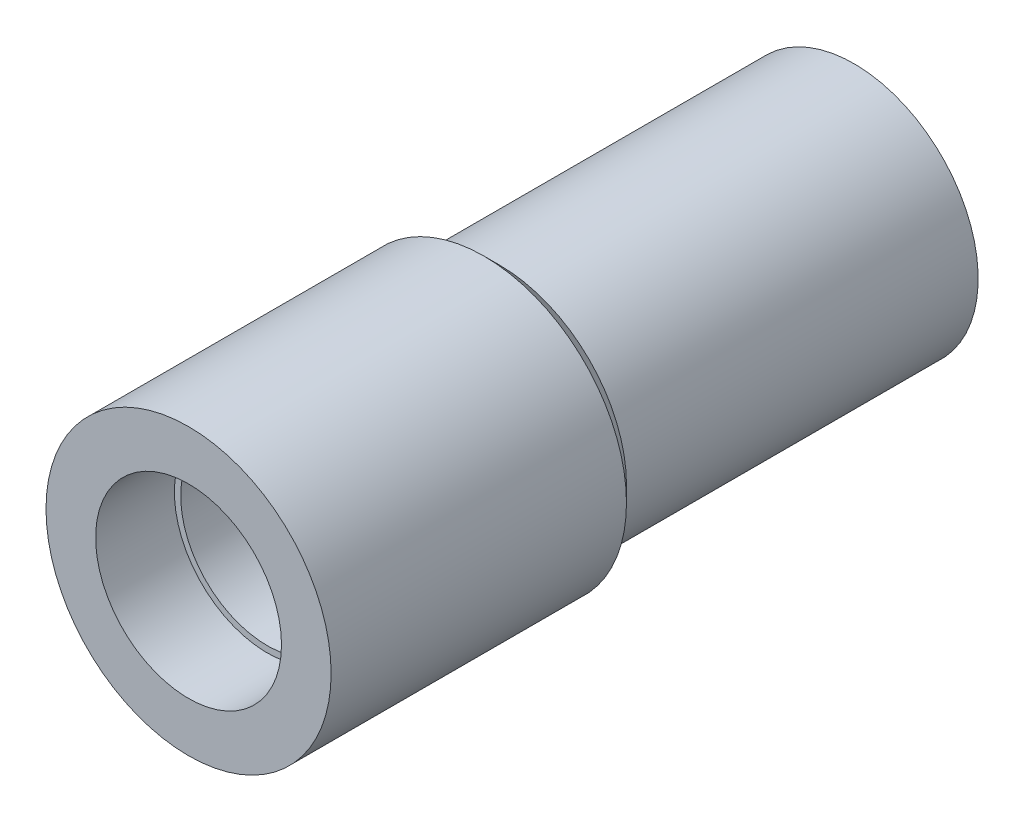
ISO-10303-21;
HEADER;
FILE_DESCRIPTION(('STEP AP214'),'2;1');
FILE_NAME('part.step','',(''),(''),'','','');
FILE_SCHEMA(('AUTOMOTIVE_DESIGN { 1 0 10303 214 1 1 1 1 }'));
ENDSEC;
DATA;
#1=APPLICATION_CONTEXT('core data for automotive mechanical design processes');
#2=APPLICATION_PROTOCOL_DEFINITION('international standard','automotive_design',2000,#1);
#3=PRODUCT_CONTEXT('',#1,'mechanical');
#4=PRODUCT('Part','Part','',(#3));
#5=PRODUCT_RELATED_PRODUCT_CATEGORY('part','',(#4));
#6=PRODUCT_DEFINITION_FORMATION('','',#4);
#7=PRODUCT_DEFINITION_CONTEXT('part definition',#1,'design');
#8=PRODUCT_DEFINITION('design','',#6,#7);
#9=PRODUCT_DEFINITION_SHAPE('','',#8);
#10=(LENGTH_UNIT() NAMED_UNIT(*) SI_UNIT(.MILLI.,.METRE.));
#11=(NAMED_UNIT(*) PLANE_ANGLE_UNIT() SI_UNIT($,.RADIAN.));
#12=(NAMED_UNIT(*) SI_UNIT($,.STERADIAN.) SOLID_ANGLE_UNIT());
#13=UNCERTAINTY_MEASURE_WITH_UNIT(LENGTH_MEASURE(1.E-05),#10,'distance_accuracy_value','');
#14=(GEOMETRIC_REPRESENTATION_CONTEXT(3) GLOBAL_UNCERTAINTY_ASSIGNED_CONTEXT((#13)) GLOBAL_UNIT_ASSIGNED_CONTEXT((#10,
#11,#12)) REPRESENTATION_CONTEXT('',''));
#15=CARTESIAN_POINT('',(0.,0.,0.));
#16=DIRECTION('',(0.,0.,1.));
#17=DIRECTION('',(1.,0.,0.));
#18=AXIS2_PLACEMENT_3D('',#15,#16,#17);
#19=CARTESIAN_POINT('',(0.,0.,0.));
#20=DIRECTION('',(0.,0.,1.));
#21=DIRECTION('',(1.,0.,0.));
#22=AXIS2_PLACEMENT_3D('',#19,#20,#21);
#23=CYLINDRICAL_SURFACE('',#22,2.794);
#24=CARTESIAN_POINT('',(0.,0.,18.923));
#25=DIRECTION('',(0.,0.,1.));
#26=DIRECTION('',(1.,0.,0.));
#27=AXIS2_PLACEMENT_3D('',#24,#25,#26);
#28=CIRCLE('',#27,2.794);
#29=CARTESIAN_POINT('',(2.794,0.,18.923));
#30=VERTEX_POINT('',#29);
#31=EDGE_CURVE('E52',#30,#30,#28,.F.);
#32=ORIENTED_EDGE('',*,*,#31,.F.);
#33=EDGE_LOOP('',(#32));
#34=FACE_BOUND('',#33,.T.);
#35=CARTESIAN_POINT('',(0.,0.,2.54));
#36=DIRECTION('',(0.,0.,-1.));
#37=DIRECTION('',(-1.,0.,0.));
#38=AXIS2_PLACEMENT_3D('',#35,#36,#37);
#39=CIRCLE('',#38,2.794);
#40=CARTESIAN_POINT('',(-2.794,0.,2.54));
#41=VERTEX_POINT('',#40);
#42=EDGE_CURVE('E55',#41,#41,#39,.F.);
#43=ORIENTED_EDGE('',*,*,#42,.F.);
#44=EDGE_LOOP('',(#43));
#45=FACE_BOUND('',#44,.T.);
#46=ADVANCED_FACE('F37',(#34,#45),#23,.F.);
#47=CARTESIAN_POINT('',(0.,0.,21.463));
#48=DIRECTION('',(0.,0.,-1.));
#49=DIRECTION('',(-1.,0.,0.));
#50=AXIS2_PLACEMENT_3D('',#47,#48,#49);
#51=CYLINDRICAL_SURFACE('',#50,4.5974);
#52=CARTESIAN_POINT('',(0.,0.,11.938));
#53=DIRECTION('',(0.,0.,-1.));
#54=DIRECTION('',(-1.,0.,0.));
#55=AXIS2_PLACEMENT_3D('',#52,#53,#54);
#56=CIRCLE('',#55,4.5974);
#57=CARTESIAN_POINT('',(-4.5974,0.,11.938));
#58=VERTEX_POINT('',#57);
#59=EDGE_CURVE('E11',#58,#58,#56,.F.);
#60=ORIENTED_EDGE('',*,*,#59,.T.);
#61=EDGE_LOOP('',(#60));
#62=FACE_BOUND('',#61,.T.);
#63=CARTESIAN_POINT('',(0.,0.,21.463));
#64=DIRECTION('',(0.,0.,1.));
#65=DIRECTION('',(1.,0.,0.));
#66=AXIS2_PLACEMENT_3D('',#63,#64,#65);
#67=CIRCLE('',#66,4.5974);
#68=CARTESIAN_POINT('',(4.5974,0.,21.463));
#69=VERTEX_POINT('',#68);
#70=EDGE_CURVE('E48',#69,#69,#67,.T.);
#71=ORIENTED_EDGE('',*,*,#70,.F.);
#72=EDGE_LOOP('',(#71));
#73=FACE_BOUND('',#72,.T.);
#74=ADVANCED_FACE('F39',(#62,#73),#51,.T.);
#75=CARTESIAN_POINT('',(0.,0.,0.));
#76=DIRECTION('',(0.,0.,1.));
#77=DIRECTION('',(1.,0.,0.));
#78=AXIS2_PLACEMENT_3D('',#75,#76,#77);
#79=PLANE('',#78);
#80=CARTESIAN_POINT('',(0.,0.,0.));
#81=DIRECTION('',(0.,0.,-1.));
#82=DIRECTION('',(-1.,0.,0.));
#83=AXIS2_PLACEMENT_3D('',#80,#81,#82);
#84=CIRCLE('',#83,2.9972);
#85=CARTESIAN_POINT('',(-2.9972,0.,0.));
#86=VERTEX_POINT('',#85);
#87=EDGE_CURVE('E75',#86,#86,#84,.T.);
#88=ORIENTED_EDGE('',*,*,#87,.F.);
#89=EDGE_LOOP('',(#88));
#90=FACE_BOUND('',#89,.T.);
#91=CARTESIAN_POINT('',(0.,0.,0.));
#92=DIRECTION('',(0.,0.,-1.));
#93=DIRECTION('',(-1.,0.,0.));
#94=AXIS2_PLACEMENT_3D('',#91,#92,#93);
#95=CIRCLE('',#94,4.0005);
#96=CARTESIAN_POINT('',(-4.0005,0.,0.));
#97=VERTEX_POINT('',#96);
#98=EDGE_CURVE('E58',#97,#97,#95,.T.);
#99=ORIENTED_EDGE('',*,*,#98,.T.);
#100=EDGE_LOOP('',(#99));
#101=FACE_BOUND('',#100,.T.);
#102=ADVANCED_FACE('F81',(#90,#101),#79,.F.);
#103=CARTESIAN_POINT('',(0.,0.,21.463));
#104=DIRECTION('',(0.,0.,1.));
#105=DIRECTION('',(1.,0.,0.));
#106=AXIS2_PLACEMENT_3D('',#103,#104,#105);
#107=PLANE('',#106);
#108=CARTESIAN_POINT('',(0.,0.,21.463));
#109=DIRECTION('',(0.,0.,1.));
#110=DIRECTION('',(1.,0.,0.));
#111=AXIS2_PLACEMENT_3D('',#108,#109,#110);
#112=CIRCLE('',#111,2.9972);
#113=CARTESIAN_POINT('',(2.9972,0.,21.463));
#114=VERTEX_POINT('',#113);
#115=EDGE_CURVE('E65',#114,#114,#112,.T.);
#116=ORIENTED_EDGE('',*,*,#115,.F.);
#117=EDGE_LOOP('',(#116));
#118=FACE_BOUND('',#117,.T.);
#119=ORIENTED_EDGE('',*,*,#70,.T.);
#120=EDGE_LOOP('',(#119));
#121=FACE_BOUND('',#120,.T.);
#122=ADVANCED_FACE('F84',(#118,#121),#107,.T.);
#123=CARTESIAN_POINT('',(0.,0.,18.923));
#124=DIRECTION('',(0.,0.,1.));
#125=DIRECTION('',(1.,0.,0.));
#126=AXIS2_PLACEMENT_3D('',#123,#124,#125);
#127=PLANE('',#126);
#128=CARTESIAN_POINT('',(0.,0.,18.923));
#129=DIRECTION('',(0.,0.,1.));
#130=DIRECTION('',(1.,0.,0.));
#131=AXIS2_PLACEMENT_3D('',#128,#129,#130);
#132=CIRCLE('',#131,2.9972);
#133=CARTESIAN_POINT('',(2.9972,0.,18.923));
#134=VERTEX_POINT('',#133);
#135=EDGE_CURVE('E61',#134,#134,#132,.T.);
#136=ORIENTED_EDGE('',*,*,#135,.T.);
#137=EDGE_LOOP('',(#136));
#138=FACE_BOUND('',#137,.T.);
#139=ORIENTED_EDGE('',*,*,#31,.T.);
#140=EDGE_LOOP('',(#139));
#141=FACE_BOUND('',#140,.T.);
#142=ADVANCED_FACE('F114',(#138,#141),#127,.T.);
#143=CARTESIAN_POINT('',(0.,0.,18.923));
#144=DIRECTION('',(0.,0.,1.));
#145=DIRECTION('',(1.,0.,0.));
#146=AXIS2_PLACEMENT_3D('',#143,#144,#145);
#147=CYLINDRICAL_SURFACE('',#146,2.9972);
#148=ORIENTED_EDGE('',*,*,#135,.F.);
#149=EDGE_LOOP('',(#148));
#150=FACE_BOUND('',#149,.T.);
#151=ORIENTED_EDGE('',*,*,#115,.T.);
#152=EDGE_LOOP('',(#151));
#153=FACE_BOUND('',#152,.T.);
#154=ADVANCED_FACE('F100',(#150,#153),#147,.F.);
#155=CARTESIAN_POINT('',(0.,0.,11.43));
#156=DIRECTION('',(0.,0.,-1.));
#157=DIRECTION('',(-1.,0.,0.));
#158=AXIS2_PLACEMENT_3D('',#155,#156,#157);
#159=PLANE('',#158);
#160=CARTESIAN_POINT('',(0.,0.,11.43));
#161=DIRECTION('',(0.,0.,-1.));
#162=DIRECTION('',(-1.,0.,0.));
#163=AXIS2_PLACEMENT_3D('',#160,#161,#162);
#164=CIRCLE('',#163,4.08939999999999);
#165=CARTESIAN_POINT('',(-4.08939999999999,0.,11.43));
#166=VERTEX_POINT('',#165);
#167=EDGE_CURVE('E44',#166,#166,#164,.T.);
#168=ORIENTED_EDGE('',*,*,#167,.T.);
#169=EDGE_LOOP('',(#168));
#170=FACE_BOUND('',#169,.T.);
#171=CARTESIAN_POINT('',(0.,0.,11.43));
#172=DIRECTION('',(0.,0.,-1.));
#173=DIRECTION('',(-1.,0.,0.));
#174=AXIS2_PLACEMENT_3D('',#171,#172,#173);
#175=CIRCLE('',#174,4.0005);
#176=CARTESIAN_POINT('',(-4.0005,0.,11.43));
#177=VERTEX_POINT('',#176);
#178=EDGE_CURVE('E68',#177,#177,#175,.T.);
#179=ORIENTED_EDGE('',*,*,#178,.F.);
#180=EDGE_LOOP('',(#179));
#181=FACE_BOUND('',#180,.T.);
#182=ADVANCED_FACE('F91',(#170,#181),#159,.T.);
#183=CARTESIAN_POINT('',(0.,0.,11.43));
#184=DIRECTION('',(0.,0.,-1.));
#185=DIRECTION('',(-1.,0.,0.));
#186=AXIS2_PLACEMENT_3D('',#183,#184,#185);
#187=CYLINDRICAL_SURFACE('',#186,4.0005);
#188=CARTESIAN_POINT('',(-4.0005,0.,11.43));
#189=CARTESIAN_POINT('',(-4.0005,0.,11.3109375));
#190=CARTESIAN_POINT('',(-4.0005,0.,11.191875));
#191=CARTESIAN_POINT('',(-4.0005,0.,10.95375));
#192=CARTESIAN_POINT('',(-4.0005,0.,10.8346875));
#193=CARTESIAN_POINT('',(-4.0005,0.,10.5965625));
#194=CARTESIAN_POINT('',(-4.0005,0.,10.4775));
#195=CARTESIAN_POINT('',(-4.0005,0.,10.239375));
#196=CARTESIAN_POINT('',(-4.0005,0.,10.1203125));
#197=CARTESIAN_POINT('',(-4.0005,0.,9.8821875));
#198=CARTESIAN_POINT('',(-4.0005,0.,9.763125));
#199=CARTESIAN_POINT('',(-4.0005,0.,9.525));
#200=CARTESIAN_POINT('',(-4.0005,0.,9.4059375));
#201=CARTESIAN_POINT('',(-4.0005,0.,9.1678125));
#202=CARTESIAN_POINT('',(-4.0005,0.,9.04875));
#203=CARTESIAN_POINT('',(-4.0005,0.,8.810625));
#204=CARTESIAN_POINT('',(-4.0005,0.,8.6915625));
#205=CARTESIAN_POINT('',(-4.0005,0.,8.4534375));
#206=CARTESIAN_POINT('',(-4.0005,0.,8.334375));
#207=CARTESIAN_POINT('',(-4.0005,0.,8.09625));
#208=CARTESIAN_POINT('',(-4.0005,0.,7.9771875));
#209=CARTESIAN_POINT('',(-4.0005,0.,7.7390625));
#210=CARTESIAN_POINT('',(-4.0005,0.,7.62));
#211=CARTESIAN_POINT('',(-4.0005,0.,7.381875));
#212=CARTESIAN_POINT('',(-4.0005,0.,7.2628125));
#213=CARTESIAN_POINT('',(-4.0005,0.,7.0246875));
#214=CARTESIAN_POINT('',(-4.0005,0.,6.905625));
#215=CARTESIAN_POINT('',(-4.0005,0.,6.6675));
#216=CARTESIAN_POINT('',(-4.0005,0.,6.5484375));
#217=CARTESIAN_POINT('',(-4.0005,0.,6.3103125));
#218=CARTESIAN_POINT('',(-4.0005,0.,6.19125));
#219=CARTESIAN_POINT('',(-4.0005,0.,5.953125));
#220=CARTESIAN_POINT('',(-4.0005,0.,5.8340625));
#221=CARTESIAN_POINT('',(-4.0005,0.,5.5959375));
#222=CARTESIAN_POINT('',(-4.0005,0.,5.476875));
#223=CARTESIAN_POINT('',(-4.0005,0.,5.23875));
#224=CARTESIAN_POINT('',(-4.0005,0.,5.1196875));
#225=CARTESIAN_POINT('',(-4.0005,0.,4.8815625));
#226=CARTESIAN_POINT('',(-4.0005,0.,4.7625));
#227=CARTESIAN_POINT('',(-4.0005,0.,4.524375));
#228=CARTESIAN_POINT('',(-4.0005,0.,4.4053125));
#229=CARTESIAN_POINT('',(-4.0005,0.,4.1671875));
#230=CARTESIAN_POINT('',(-4.0005,0.,4.048125));
#231=CARTESIAN_POINT('',(-4.0005,0.,3.81));
#232=CARTESIAN_POINT('',(-4.0005,0.,3.6909375));
#233=CARTESIAN_POINT('',(-4.0005,0.,3.4528125));
#234=CARTESIAN_POINT('',(-4.0005,0.,3.33375));
#235=CARTESIAN_POINT('',(-4.0005,0.,3.095625));
#236=CARTESIAN_POINT('',(-4.0005,0.,2.9765625));
#237=CARTESIAN_POINT('',(-4.0005,0.,2.7384375));
#238=CARTESIAN_POINT('',(-4.0005,0.,2.619375));
#239=CARTESIAN_POINT('',(-4.0005,0.,2.38125));
#240=CARTESIAN_POINT('',(-4.0005,0.,2.2621875));
#241=CARTESIAN_POINT('',(-4.0005,0.,2.0240625));
#242=CARTESIAN_POINT('',(-4.0005,0.,1.905));
#243=CARTESIAN_POINT('',(-4.0005,0.,1.666875));
#244=CARTESIAN_POINT('',(-4.0005,0.,1.5478125));
#245=CARTESIAN_POINT('',(-4.0005,0.,1.3096875));
#246=CARTESIAN_POINT('',(-4.0005,0.,1.190625));
#247=CARTESIAN_POINT('',(-4.0005,0.,0.952499999999999));
#248=CARTESIAN_POINT('',(-4.0005,0.,0.833437499999999));
#249=CARTESIAN_POINT('',(-4.0005,0.,0.595312499999998));
#250=CARTESIAN_POINT('',(-4.0005,0.,0.476249999999998));
#251=CARTESIAN_POINT('',(-4.0005,0.,0.238124999999998));
#252=CARTESIAN_POINT('',(-4.0005,0.,0.119062499999998));
#253=CARTESIAN_POINT('',(-4.0005,0.,0.));
#254=B_SPLINE_CURVE_WITH_KNOTS('',3,(#188,#189,#190,#191,#192,#193,#194,#195,#196,#197,#198,
#199,#200,#201,#202,#203,#204,#205,#206,#207,#208,#209,#210,#211,#212,#213,#214,#215,#216,#217,
#218,#219,#220,#221,#222,#223,#224,#225,#226,#227,#228,#229,#230,#231,#232,#233,#234,#235,#236,
#237,#238,#239,#240,#241,#242,#243,#244,#245,#246,#247,#248,#249,#250,#251,#252,#253),
.UNSPECIFIED.,.F.,.F.,(4,2,2,2,2,2,2,2,2,2,2,2,2,2,2,2,2,2,2,2,2,2,2,2,2,2,2,2,2,2,2,2,4),(0.,
0.357187500000002,0.714375000000001,1.0715625,1.42875,1.7859375,2.143125,2.5003125,2.8575,
3.2146875,3.571875,3.9290625,4.28625,4.6434375,5.000625,5.3578125,5.715,6.0721875,6.429375,
6.7865625,7.14375,7.5009375,7.858125,8.2153125,8.5725,8.9296875,9.286875,9.6440625,10.00125,
10.3584375,10.715625,11.0728125,11.43),.UNSPECIFIED.);
#255=EDGE_CURVE('BSEAM88',#177,#97,#254,.T.);
#256=ORIENTED_EDGE('',*,*,#178,.T.);
#257=ORIENTED_EDGE('',*,*,#98,.F.);
#258=ORIENTED_EDGE('',*,*,#255,.T.);
#259=ORIENTED_EDGE('',*,*,#255,.F.);
#260=EDGE_LOOP('',(#256,#258,#257,#259));
#261=FACE_BOUND('',#260,.T.);
#262=ADVANCED_FACE('F88',(#261),#187,.T.);
#263=CARTESIAN_POINT('',(0.,0.,2.54));
#264=DIRECTION('',(0.,0.,-1.));
#265=DIRECTION('',(-1.,0.,0.));
#266=AXIS2_PLACEMENT_3D('',#263,#264,#265);
#267=PLANE('',#266);
#268=CARTESIAN_POINT('',(0.,0.,2.54));
#269=DIRECTION('',(0.,0.,-1.));
#270=DIRECTION('',(-1.,0.,0.));
#271=AXIS2_PLACEMENT_3D('',#268,#269,#270);
#272=CIRCLE('',#271,2.9972);
#273=CARTESIAN_POINT('',(-2.9972,0.,2.54));
#274=VERTEX_POINT('',#273);
#275=EDGE_CURVE('E59',#274,#274,#272,.T.);
#276=ORIENTED_EDGE('',*,*,#275,.T.);
#277=EDGE_LOOP('',(#276));
#278=FACE_BOUND('',#277,.T.);
#279=ORIENTED_EDGE('',*,*,#42,.T.);
#280=EDGE_LOOP('',(#279));
#281=FACE_BOUND('',#280,.T.);
#282=ADVANCED_FACE('F90',(#278,#281),#267,.T.);
#283=CARTESIAN_POINT('',(0.,0.,2.54));
#284=DIRECTION('',(0.,0.,-1.));
#285=DIRECTION('',(-1.,0.,0.));
#286=AXIS2_PLACEMENT_3D('',#283,#284,#285);
#287=CYLINDRICAL_SURFACE('',#286,2.9972);
#288=ORIENTED_EDGE('',*,*,#275,.F.);
#289=EDGE_LOOP('',(#288));
#290=FACE_BOUND('',#289,.T.);
#291=ORIENTED_EDGE('',*,*,#87,.T.);
#292=EDGE_LOOP('',(#291));
#293=FACE_BOUND('',#292,.T.);
#294=ADVANCED_FACE('F79',(#290,#293),#287,.F.);
#295=CARTESIAN_POINT('',(0.,0.,11.43));
#296=DIRECTION('',(0.,0.,1.));
#297=DIRECTION('',(1.,0.,0.));
#298=AXIS2_PLACEMENT_3D('',#295,#296,#297);
#299=CONICAL_SURFACE('',#298,4.08939999999999,0.785398163397448);
#300=ORIENTED_EDGE('',*,*,#59,.F.);
#301=EDGE_LOOP('',(#300));
#302=FACE_BOUND('',#301,.T.);
#303=ORIENTED_EDGE('',*,*,#167,.F.);
#304=EDGE_LOOP('',(#303));
#305=FACE_BOUND('',#304,.T.);
#306=ADVANCED_FACE('F163',(#302,#305),#299,.T.);
#307=CLOSED_SHELL('',(#46,#74,#102,#122,#142,#154,#182,#262,#282,#294,#306));
#308=MANIFOLD_SOLID_BREP('B2',#307);
#309=ADVANCED_BREP_SHAPE_REPRESENTATION('',(#18,#308),#14);
#310=SHAPE_DEFINITION_REPRESENTATION(#9,#309);
ENDSEC;
END-ISO-10303-21;
